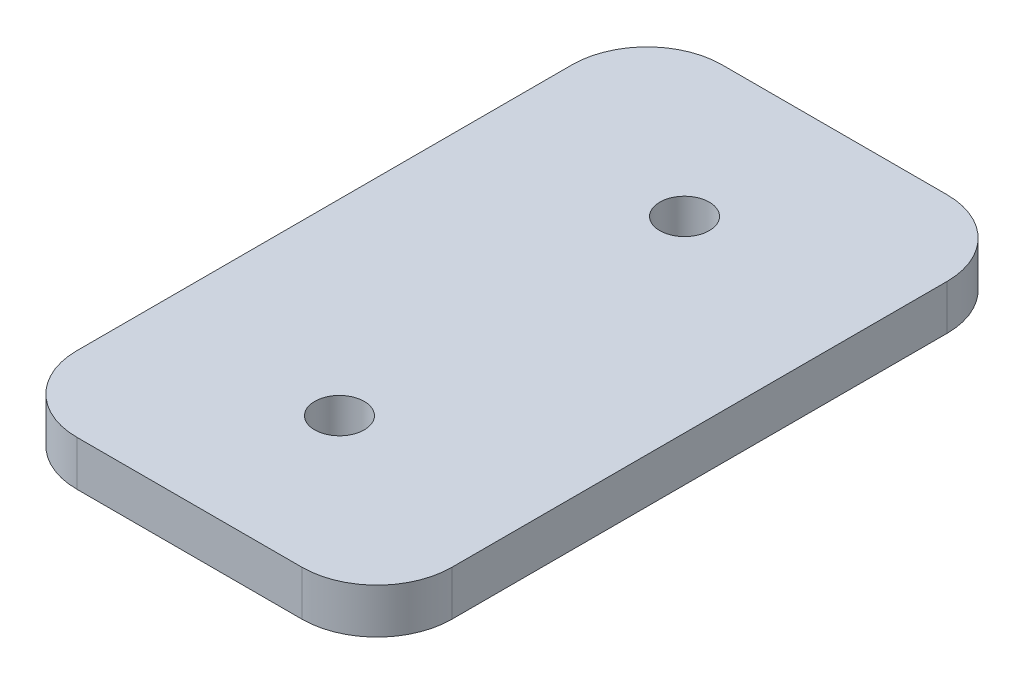
ISO-10303-21;
HEADER;
FILE_DESCRIPTION(('STEP AP214'),'2;1');
FILE_NAME('part.step','',(''),(''),'','','');
FILE_SCHEMA(('AUTOMOTIVE_DESIGN { 1 0 10303 214 1 1 1 1 }'));
ENDSEC;
DATA;
#1=APPLICATION_CONTEXT('core data for automotive mechanical design processes');
#2=APPLICATION_PROTOCOL_DEFINITION('international standard','automotive_design',2000,#1);
#3=PRODUCT_CONTEXT('',#1,'mechanical');
#4=PRODUCT('Part','Part','',(#3));
#5=PRODUCT_RELATED_PRODUCT_CATEGORY('part','',(#4));
#6=PRODUCT_DEFINITION_FORMATION('','',#4);
#7=PRODUCT_DEFINITION_CONTEXT('part definition',#1,'design');
#8=PRODUCT_DEFINITION('design','',#6,#7);
#9=PRODUCT_DEFINITION_SHAPE('','',#8);
#10=(LENGTH_UNIT() NAMED_UNIT(*) SI_UNIT(.MILLI.,.METRE.));
#11=(NAMED_UNIT(*) PLANE_ANGLE_UNIT() SI_UNIT($,.RADIAN.));
#12=(NAMED_UNIT(*) SI_UNIT($,.STERADIAN.) SOLID_ANGLE_UNIT());
#13=UNCERTAINTY_MEASURE_WITH_UNIT(LENGTH_MEASURE(1.E-05),#10,'distance_accuracy_value','');
#14=(GEOMETRIC_REPRESENTATION_CONTEXT(3) GLOBAL_UNCERTAINTY_ASSIGNED_CONTEXT((#13)) GLOBAL_UNIT_ASSIGNED_CONTEXT((#10,
#11,#12)) REPRESENTATION_CONTEXT('',''));
#15=CARTESIAN_POINT('',(0.,0.,0.));
#16=DIRECTION('',(0.,0.,1.));
#17=DIRECTION('',(1.,0.,0.));
#18=AXIS2_PLACEMENT_3D('',#15,#16,#17);
#19=CARTESIAN_POINT('',(346.231060122937,19.,-46.));
#20=DIRECTION('',(-1.,0.,0.));
#21=DIRECTION('',(0.,0.,1.));
#22=AXIS2_PLACEMENT_3D('',#19,#20,#21);
#23=PLANE('',#22);
#24=DIRECTION('',(0.,0.,1.));
#25=VECTOR('',#24,1.);
#26=CARTESIAN_POINT('',(346.231060122937,25.,-46.));
#27=LINE('',#26,#25);
#28=CARTESIAN_POINT('',(346.231060122937,25.,-36.));
#29=VERTEX_POINT('',#28);
#30=CARTESIAN_POINT('',(346.231060122937,25.,30.));
#31=VERTEX_POINT('',#30);
#32=EDGE_CURVE('E124',#29,#31,#27,.T.);
#33=ORIENTED_EDGE('',*,*,#32,.F.);
#34=DIRECTION('',(0.,-1.,0.));
#35=VECTOR('',#34,1.);
#36=CARTESIAN_POINT('',(346.231060122937,19.,-36.));
#37=LINE('',#36,#35);
#38=CARTESIAN_POINT('',(346.231060122937,19.,-36.));
#39=VERTEX_POINT('',#38);
#40=EDGE_CURVE('E108',#29,#39,#37,.T.);
#41=ORIENTED_EDGE('',*,*,#40,.T.);
#42=DIRECTION('',(0.,0.,1.));
#43=VECTOR('',#42,1.);
#44=CARTESIAN_POINT('',(346.231060122937,19.,-46.));
#45=LINE('',#44,#43);
#46=CARTESIAN_POINT('',(346.231060122937,19.,30.));
#47=VERTEX_POINT('',#46);
#48=EDGE_CURVE('E121',#39,#47,#45,.T.);
#49=ORIENTED_EDGE('',*,*,#48,.T.);
#50=DIRECTION('',(0.,-1.,0.));
#51=VECTOR('',#50,1.);
#52=CARTESIAN_POINT('',(346.231060122937,19.,30.));
#53=LINE('',#52,#51);
#54=EDGE_CURVE('E127',#47,#31,#53,.F.);
#55=ORIENTED_EDGE('',*,*,#54,.T.);
#56=EDGE_LOOP('',(#33,#41,#49,#55));
#57=FACE_BOUND('',#56,.T.);
#58=ADVANCED_FACE('F36',(#57),#23,.T.);
#59=CARTESIAN_POINT('',(396.231060122937,24.9999999999999,-46.));
#60=DIRECTION('',(0.,1.,0.));
#61=DIRECTION('',(-1.,0.,0.));
#62=AXIS2_PLACEMENT_3D('',#59,#60,#61);
#63=PLANE('',#62);
#64=CARTESIAN_POINT('',(371.231060122937,25.,-26.));
#65=DIRECTION('',(0.,-1.,0.));
#66=DIRECTION('',(1.,0.,0.));
#67=AXIS2_PLACEMENT_3D('',#64,#65,#66);
#68=CIRCLE('',#67,3.30000000000003);
#69=CARTESIAN_POINT('',(374.531060122937,25.,-26.));
#70=VERTEX_POINT('',#69);
#71=EDGE_CURVE('E195',#70,#70,#68,.T.);
#72=ORIENTED_EDGE('',*,*,#71,.T.);
#73=EDGE_LOOP('',(#72));
#74=FACE_BOUND('',#73,.T.);
#75=CARTESIAN_POINT('',(371.231060122937,25.,20.));
#76=DIRECTION('',(0.,-1.,0.));
#77=DIRECTION('',(-1.,0.,0.));
#78=AXIS2_PLACEMENT_3D('',#75,#76,#77);
#79=CIRCLE('',#78,3.30000000000003);
#80=CARTESIAN_POINT('',(367.931060122937,25.,20.));
#81=VERTEX_POINT('',#80);
#82=EDGE_CURVE('E261',#81,#81,#79,.T.);
#83=ORIENTED_EDGE('',*,*,#82,.T.);
#84=EDGE_LOOP('',(#83));
#85=FACE_BOUND('',#84,.T.);
#86=DIRECTION('',(-1.,0.,0.));
#87=VECTOR('',#86,1.);
#88=CARTESIAN_POINT('',(396.231060122937,24.9999999999999,-46.));
#89=LINE('',#88,#87);
#90=CARTESIAN_POINT('',(386.231060122937,24.9999999999999,-46.));
#91=VERTEX_POINT('',#90);
#92=CARTESIAN_POINT('',(356.231060122937,25.,-46.));
#93=VERTEX_POINT('',#92);
#94=EDGE_CURVE('E134',#91,#93,#89,.T.);
#95=ORIENTED_EDGE('',*,*,#94,.T.);
#96=CARTESIAN_POINT('',(356.231060122937,25.,-36.));
#97=DIRECTION('',(0.,1.,0.));
#98=DIRECTION('',(-1.,0.,0.));
#99=AXIS2_PLACEMENT_3D('',#96,#97,#98);
#100=CIRCLE('',#99,10.);
#101=EDGE_CURVE('E166',#93,#29,#100,.T.);
#102=ORIENTED_EDGE('',*,*,#101,.T.);
#103=ORIENTED_EDGE('',*,*,#32,.T.);
#104=CARTESIAN_POINT('',(356.231060122937,25.,30.));
#105=DIRECTION('',(0.,1.,0.));
#106=DIRECTION('',(-1.,0.,0.));
#107=AXIS2_PLACEMENT_3D('',#104,#105,#106);
#108=CIRCLE('',#107,10.);
#109=CARTESIAN_POINT('',(356.231060122937,25.,40.));
#110=VERTEX_POINT('',#109);
#111=EDGE_CURVE('E162',#31,#110,#108,.T.);
#112=ORIENTED_EDGE('',*,*,#111,.T.);
#113=DIRECTION('',(-1.,0.,0.));
#114=VECTOR('',#113,1.);
#115=CARTESIAN_POINT('',(396.231060122937,24.9999999999999,40.));
#116=LINE('',#115,#114);
#117=CARTESIAN_POINT('',(386.231060122937,24.9999999999999,40.));
#118=VERTEX_POINT('',#117);
#119=EDGE_CURVE('E183',#118,#110,#116,.T.);
#120=ORIENTED_EDGE('',*,*,#119,.F.);
#121=CARTESIAN_POINT('',(386.231060122937,24.9999999999999,30.));
#122=DIRECTION('',(0.,1.,0.));
#123=DIRECTION('',(-1.,0.,0.));
#124=AXIS2_PLACEMENT_3D('',#121,#122,#123);
#125=CIRCLE('',#124,10.);
#126=CARTESIAN_POINT('',(396.231060122937,24.9999999999999,30.));
#127=VERTEX_POINT('',#126);
#128=EDGE_CURVE('E52',#118,#127,#125,.T.);
#129=ORIENTED_EDGE('',*,*,#128,.T.);
#130=DIRECTION('',(0.,0.,1.));
#131=VECTOR('',#130,1.);
#132=CARTESIAN_POINT('',(396.231060122937,24.9999999999999,-46.));
#133=LINE('',#132,#131);
#134=CARTESIAN_POINT('',(396.231060122937,24.9999999999999,-36.));
#135=VERTEX_POINT('',#134);
#136=EDGE_CURVE('E140',#135,#127,#133,.T.);
#137=ORIENTED_EDGE('',*,*,#136,.F.);
#138=CARTESIAN_POINT('',(386.231060122937,24.9999999999999,-36.));
#139=DIRECTION('',(0.,1.,0.));
#140=DIRECTION('',(-1.,0.,0.));
#141=AXIS2_PLACEMENT_3D('',#138,#139,#140);
#142=CIRCLE('',#141,10.);
#143=EDGE_CURVE('E60',#135,#91,#142,.T.);
#144=ORIENTED_EDGE('',*,*,#143,.T.);
#145=EDGE_LOOP('',(#95,#102,#103,#112,#120,#129,#137,#144));
#146=FACE_BOUND('',#145,.T.);
#147=ADVANCED_FACE('F188',(#74,#85,#146),#63,.T.);
#148=CARTESIAN_POINT('',(396.231060122937,19.,-46.));
#149=DIRECTION('',(1.,0.,0.));
#150=DIRECTION('',(0.,0.,-1.));
#151=AXIS2_PLACEMENT_3D('',#148,#149,#150);
#152=PLANE('',#151);
#153=DIRECTION('',(0.,0.,1.));
#154=VECTOR('',#153,1.);
#155=CARTESIAN_POINT('',(396.231060122937,19.,-46.));
#156=LINE('',#155,#154);
#157=CARTESIAN_POINT('',(396.231060122937,19.,-36.));
#158=VERTEX_POINT('',#157);
#159=CARTESIAN_POINT('',(396.231060122937,19.,30.));
#160=VERTEX_POINT('',#159);
#161=EDGE_CURVE('E133',#158,#160,#156,.T.);
#162=ORIENTED_EDGE('',*,*,#161,.F.);
#163=DIRECTION('',(0.,1.,0.));
#164=VECTOR('',#163,1.);
#165=CARTESIAN_POINT('',(396.231060122937,24.9999999999999,-36.));
#166=LINE('',#165,#164);
#167=EDGE_CURVE('E172',#158,#135,#166,.T.);
#168=ORIENTED_EDGE('',*,*,#167,.T.);
#169=ORIENTED_EDGE('',*,*,#136,.T.);
#170=DIRECTION('',(0.,1.,0.));
#171=VECTOR('',#170,1.);
#172=CARTESIAN_POINT('',(396.231060122937,19.,30.));
#173=LINE('',#172,#171);
#174=EDGE_CURVE('E169',#127,#160,#173,.F.);
#175=ORIENTED_EDGE('',*,*,#174,.T.);
#176=EDGE_LOOP('',(#162,#168,#169,#175));
#177=FACE_BOUND('',#176,.T.);
#178=ADVANCED_FACE('F203',(#177),#152,.T.);
#179=CARTESIAN_POINT('',(396.231060122937,19.,-46.));
#180=DIRECTION('',(0.,-1.,0.));
#181=DIRECTION('',(0.,0.,-1.));
#182=AXIS2_PLACEMENT_3D('',#179,#180,#181);
#183=PLANE('',#182);
#184=CARTESIAN_POINT('',(371.231060122937,19.,-26.));
#185=DIRECTION('',(0.,-1.,0.));
#186=DIRECTION('',(1.,0.,0.));
#187=AXIS2_PLACEMENT_3D('',#184,#185,#186);
#188=CIRCLE('',#187,3.30000000000003);
#189=CARTESIAN_POINT('',(374.531060122937,19.,-26.));
#190=VERTEX_POINT('',#189);
#191=EDGE_CURVE('E256',#190,#190,#188,.T.);
#192=ORIENTED_EDGE('',*,*,#191,.F.);
#193=EDGE_LOOP('',(#192));
#194=FACE_BOUND('',#193,.T.);
#195=CARTESIAN_POINT('',(371.231060122937,19.,20.));
#196=DIRECTION('',(0.,-1.,0.));
#197=DIRECTION('',(-1.,0.,0.));
#198=AXIS2_PLACEMENT_3D('',#195,#196,#197);
#199=CIRCLE('',#198,3.30000000000003);
#200=CARTESIAN_POINT('',(367.931060122937,19.,20.));
#201=VERTEX_POINT('',#200);
#202=EDGE_CURVE('E259',#201,#201,#199,.T.);
#203=ORIENTED_EDGE('',*,*,#202,.F.);
#204=EDGE_LOOP('',(#203));
#205=FACE_BOUND('',#204,.T.);
#206=ORIENTED_EDGE('',*,*,#48,.F.);
#207=CARTESIAN_POINT('',(356.231060122937,19.,-36.));
#208=DIRECTION('',(0.,-1.,0.));
#209=DIRECTION('',(0.,0.,-1.));
#210=AXIS2_PLACEMENT_3D('',#207,#208,#209);
#211=CIRCLE('',#210,10.);
#212=CARTESIAN_POINT('',(356.231060122937,19.,-46.));
#213=VERTEX_POINT('',#212);
#214=EDGE_CURVE('E104',#39,#213,#211,.T.);
#215=ORIENTED_EDGE('',*,*,#214,.T.);
#216=DIRECTION('',(1.,0.,0.));
#217=VECTOR('',#216,1.);
#218=CARTESIAN_POINT('',(396.231060122937,19.,-46.));
#219=LINE('',#218,#217);
#220=CARTESIAN_POINT('',(386.231060122937,19.,-46.));
#221=VERTEX_POINT('',#220);
#222=EDGE_CURVE('E144',#213,#221,#219,.T.);
#223=ORIENTED_EDGE('',*,*,#222,.T.);
#224=CARTESIAN_POINT('',(386.231060122937,19.,-36.));
#225=DIRECTION('',(0.,-1.,0.));
#226=DIRECTION('',(0.,0.,-1.));
#227=AXIS2_PLACEMENT_3D('',#224,#225,#226);
#228=CIRCLE('',#227,10.);
#229=EDGE_CURVE('E116',#221,#158,#228,.T.);
#230=ORIENTED_EDGE('',*,*,#229,.T.);
#231=ORIENTED_EDGE('',*,*,#161,.T.);
#232=CARTESIAN_POINT('',(386.231060122937,19.,30.));
#233=DIRECTION('',(0.,-1.,0.));
#234=DIRECTION('',(0.,0.,-1.));
#235=AXIS2_PLACEMENT_3D('',#232,#233,#234);
#236=CIRCLE('',#235,10.);
#237=CARTESIAN_POINT('',(386.231060122937,19.,40.));
#238=VERTEX_POINT('',#237);
#239=EDGE_CURVE('E126',#160,#238,#236,.T.);
#240=ORIENTED_EDGE('',*,*,#239,.T.);
#241=DIRECTION('',(1.,0.,0.));
#242=VECTOR('',#241,1.);
#243=CARTESIAN_POINT('',(396.231060122937,19.,40.));
#244=LINE('',#243,#242);
#245=CARTESIAN_POINT('',(356.231060122937,19.,40.));
#246=VERTEX_POINT('',#245);
#247=EDGE_CURVE('E185',#246,#238,#244,.T.);
#248=ORIENTED_EDGE('',*,*,#247,.F.);
#249=CARTESIAN_POINT('',(356.231060122937,19.,30.));
#250=DIRECTION('',(0.,-1.,0.));
#251=DIRECTION('',(0.,0.,-1.));
#252=AXIS2_PLACEMENT_3D('',#249,#250,#251);
#253=CIRCLE('',#252,10.);
#254=EDGE_CURVE('E131',#246,#47,#253,.T.);
#255=ORIENTED_EDGE('',*,*,#254,.T.);
#256=EDGE_LOOP('',(#206,#215,#223,#230,#231,#240,#248,#255));
#257=FACE_BOUND('',#256,.T.);
#258=ADVANCED_FACE('F129',(#194,#205,#257),#183,.T.);
#259=CARTESIAN_POINT('',(0.,0.,-46.));
#260=DIRECTION('',(0.,0.,1.));
#261=DIRECTION('',(1.,0.,0.));
#262=AXIS2_PLACEMENT_3D('',#259,#260,#261);
#263=PLANE('',#262);
#264=ORIENTED_EDGE('',*,*,#222,.F.);
#265=DIRECTION('',(0.,-1.,0.));
#266=VECTOR('',#265,1.);
#267=CARTESIAN_POINT('',(356.231060122937,25.,-46.));
#268=LINE('',#267,#266);
#269=EDGE_CURVE('E109',#213,#93,#268,.F.);
#270=ORIENTED_EDGE('',*,*,#269,.T.);
#271=ORIENTED_EDGE('',*,*,#94,.F.);
#272=DIRECTION('',(0.,1.,0.));
#273=VECTOR('',#272,1.);
#274=CARTESIAN_POINT('',(386.231060122937,19.,-46.));
#275=LINE('',#274,#273);
#276=EDGE_CURVE('E115',#91,#221,#275,.F.);
#277=ORIENTED_EDGE('',*,*,#276,.T.);
#278=EDGE_LOOP('',(#264,#270,#271,#277));
#279=FACE_BOUND('',#278,.T.);
#280=ADVANCED_FACE('F208',(#279),#263,.F.);
#281=CARTESIAN_POINT('',(0.,0.,40.));
#282=DIRECTION('',(0.,0.,1.));
#283=DIRECTION('',(1.,0.,0.));
#284=AXIS2_PLACEMENT_3D('',#281,#282,#283);
#285=PLANE('',#284);
#286=ORIENTED_EDGE('',*,*,#119,.T.);
#287=DIRECTION('',(0.,-1.,0.));
#288=VECTOR('',#287,1.);
#289=CARTESIAN_POINT('',(356.231060122937,0.,40.));
#290=LINE('',#289,#288);
#291=EDGE_CURVE('E11',#110,#246,#290,.T.);
#292=ORIENTED_EDGE('',*,*,#291,.T.);
#293=ORIENTED_EDGE('',*,*,#247,.T.);
#294=DIRECTION('',(0.,1.,0.));
#295=VECTOR('',#294,1.);
#296=CARTESIAN_POINT('',(386.231060122937,0.,40.));
#297=LINE('',#296,#295);
#298=EDGE_CURVE('E45',#238,#118,#297,.T.);
#299=ORIENTED_EDGE('',*,*,#298,.T.);
#300=EDGE_LOOP('',(#286,#292,#293,#299));
#301=FACE_BOUND('',#300,.T.);
#302=ADVANCED_FACE('F182',(#301),#285,.T.);
#303=CARTESIAN_POINT('',(371.231060122937,25.,20.));
#304=DIRECTION('',(0.,-1.,0.));
#305=DIRECTION('',(1.,0.,0.));
#306=AXIS2_PLACEMENT_3D('',#303,#304,#305);
#307=CYLINDRICAL_SURFACE('',#306,3.30000000000003);
#308=ORIENTED_EDGE('',*,*,#82,.F.);
#309=EDGE_LOOP('',(#308));
#310=FACE_BOUND('',#309,.T.);
#311=ORIENTED_EDGE('',*,*,#202,.T.);
#312=EDGE_LOOP('',(#311));
#313=FACE_BOUND('',#312,.T.);
#314=ADVANCED_FACE('F232',(#310,#313),#307,.F.);
#315=CARTESIAN_POINT('',(371.231060122937,25.,-26.));
#316=DIRECTION('',(0.,-1.,0.));
#317=DIRECTION('',(1.,0.,0.));
#318=AXIS2_PLACEMENT_3D('',#315,#316,#317);
#319=CYLINDRICAL_SURFACE('',#318,3.30000000000003);
#320=ORIENTED_EDGE('',*,*,#71,.F.);
#321=EDGE_LOOP('',(#320));
#322=FACE_BOUND('',#321,.T.);
#323=ORIENTED_EDGE('',*,*,#191,.T.);
#324=EDGE_LOOP('',(#323));
#325=FACE_BOUND('',#324,.T.);
#326=ADVANCED_FACE('F228',(#322,#325),#319,.F.);
#327=CARTESIAN_POINT('',(356.231060122937,19.,-36.));
#328=DIRECTION('',(0.,1.,0.));
#329=DIRECTION('',(0.,0.,1.));
#330=AXIS2_PLACEMENT_3D('',#327,#328,#329);
#331=CYLINDRICAL_SURFACE('',#330,10.);
#332=ORIENTED_EDGE('',*,*,#101,.F.);
#333=ORIENTED_EDGE('',*,*,#269,.F.);
#334=ORIENTED_EDGE('',*,*,#214,.F.);
#335=ORIENTED_EDGE('',*,*,#40,.F.);
#336=EDGE_LOOP('',(#332,#333,#334,#335));
#337=FACE_BOUND('',#336,.T.);
#338=ADVANCED_FACE('F107',(#337),#331,.T.);
#339=CARTESIAN_POINT('',(386.231060122937,19.,-36.));
#340=DIRECTION('',(0.,-1.,0.));
#341=DIRECTION('',(0.,0.,-1.));
#342=AXIS2_PLACEMENT_3D('',#339,#340,#341);
#343=CYLINDRICAL_SURFACE('',#342,10.);
#344=ORIENTED_EDGE('',*,*,#229,.F.);
#345=ORIENTED_EDGE('',*,*,#276,.F.);
#346=ORIENTED_EDGE('',*,*,#143,.F.);
#347=ORIENTED_EDGE('',*,*,#167,.F.);
#348=EDGE_LOOP('',(#344,#345,#346,#347));
#349=FACE_BOUND('',#348,.T.);
#350=ADVANCED_FACE('F205',(#349),#343,.T.);
#351=CARTESIAN_POINT('',(356.231060122937,0.,30.));
#352=DIRECTION('',(0.,-1.,0.));
#353=DIRECTION('',(0.,0.,-1.));
#354=AXIS2_PLACEMENT_3D('',#351,#352,#353);
#355=CYLINDRICAL_SURFACE('',#354,10.);
#356=ORIENTED_EDGE('',*,*,#111,.F.);
#357=ORIENTED_EDGE('',*,*,#54,.F.);
#358=ORIENTED_EDGE('',*,*,#254,.F.);
#359=ORIENTED_EDGE('',*,*,#291,.F.);
#360=EDGE_LOOP('',(#356,#357,#358,#359));
#361=FACE_BOUND('',#360,.T.);
#362=ADVANCED_FACE('F210',(#361),#355,.T.);
#363=CARTESIAN_POINT('',(386.231060122937,0.,30.));
#364=DIRECTION('',(0.,1.,0.));
#365=DIRECTION('',(0.,0.,1.));
#366=AXIS2_PLACEMENT_3D('',#363,#364,#365);
#367=CYLINDRICAL_SURFACE('',#366,10.);
#368=ORIENTED_EDGE('',*,*,#239,.F.);
#369=ORIENTED_EDGE('',*,*,#174,.F.);
#370=ORIENTED_EDGE('',*,*,#128,.F.);
#371=ORIENTED_EDGE('',*,*,#298,.F.);
#372=EDGE_LOOP('',(#368,#369,#370,#371));
#373=FACE_BOUND('',#372,.T.);
#374=ADVANCED_FACE('F38',(#373),#367,.T.);
#375=CLOSED_SHELL('',(#58,#147,#178,#258,#280,#302,#314,#326,#338,#350,#362,#374));
#376=MANIFOLD_SOLID_BREP('B2',#375);
#377=ADVANCED_BREP_SHAPE_REPRESENTATION('',(#18,#376),#14);
#378=SHAPE_DEFINITION_REPRESENTATION(#9,#377);
ENDSEC;
END-ISO-10303-21;
